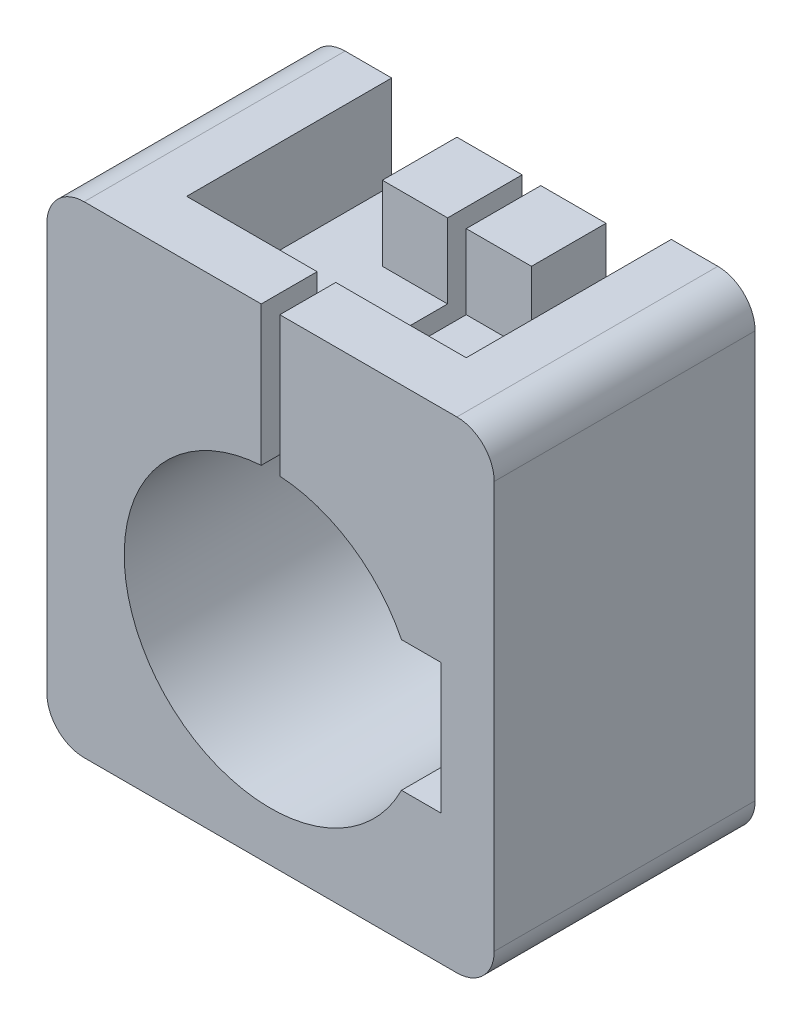
ISO-10303-21;
HEADER;
FILE_DESCRIPTION(('STEP AP214'),'2;1');
FILE_NAME('part.step','',(''),(''),'','','');
FILE_SCHEMA(('AUTOMOTIVE_DESIGN { 1 0 10303 214 1 1 1 1 }'));
ENDSEC;
DATA;
#1=APPLICATION_CONTEXT('core data for automotive mechanical design processes');
#2=APPLICATION_PROTOCOL_DEFINITION('international standard','automotive_design',2000,#1);
#3=PRODUCT_CONTEXT('',#1,'mechanical');
#4=PRODUCT('Part','Part','',(#3));
#5=PRODUCT_RELATED_PRODUCT_CATEGORY('part','',(#4));
#6=PRODUCT_DEFINITION_FORMATION('','',#4);
#7=PRODUCT_DEFINITION_CONTEXT('part definition',#1,'design');
#8=PRODUCT_DEFINITION('design','',#6,#7);
#9=PRODUCT_DEFINITION_SHAPE('','',#8);
#10=(LENGTH_UNIT() NAMED_UNIT(*) SI_UNIT(.MILLI.,.METRE.));
#11=(NAMED_UNIT(*) PLANE_ANGLE_UNIT() SI_UNIT($,.RADIAN.));
#12=(NAMED_UNIT(*) SI_UNIT($,.STERADIAN.) SOLID_ANGLE_UNIT());
#13=UNCERTAINTY_MEASURE_WITH_UNIT(LENGTH_MEASURE(1.E-05),#10,'distance_accuracy_value','');
#14=(GEOMETRIC_REPRESENTATION_CONTEXT(3) GLOBAL_UNCERTAINTY_ASSIGNED_CONTEXT((#13)) GLOBAL_UNIT_ASSIGNED_CONTEXT((#10,
#11,#12)) REPRESENTATION_CONTEXT('',''));
#15=CARTESIAN_POINT('',(0.,0.,0.));
#16=DIRECTION('',(0.,0.,1.));
#17=DIRECTION('',(1.,0.,0.));
#18=AXIS2_PLACEMENT_3D('',#15,#16,#17);
#19=CARTESIAN_POINT('',(0.5,10.3340602499598,7.));
#20=DIRECTION('',(0.,-1.,0.));
#21=DIRECTION('',(0.,0.,-1.));
#22=AXIS2_PLACEMENT_3D('',#19,#20,#21);
#23=PLANE('',#22);
#24=DIRECTION('',(0.,0.,-1.));
#25=VECTOR('',#24,1.);
#26=CARTESIAN_POINT('',(7.5,10.3340602499598,10.7268120235369));
#27=LINE('',#26,#25);
#28=CARTESIAN_POINT('',(7.5,10.3340602499598,4.));
#29=VERTEX_POINT('',#28);
#30=CARTESIAN_POINT('',(7.5,10.3340602499598,-7.));
#31=VERTEX_POINT('',#30);
#32=EDGE_CURVE('E224',#29,#31,#27,.T.);
#33=ORIENTED_EDGE('',*,*,#32,.T.);
#34=DIRECTION('',(-1.,0.,0.));
#35=VECTOR('',#34,1.);
#36=CARTESIAN_POINT('',(0.5,10.3340602499598,-7.));
#37=LINE('',#36,#35);
#38=CARTESIAN_POINT('',(4.,10.3340602499598,-7.));
#39=VERTEX_POINT('',#38);
#40=EDGE_CURVE('E236',#31,#39,#37,.T.);
#41=ORIENTED_EDGE('',*,*,#40,.T.);
#42=DIRECTION('',(0.,0.,-1.));
#43=VECTOR('',#42,1.);
#44=CARTESIAN_POINT('',(4.,10.3340602499598,-3.));
#45=LINE('',#44,#43);
#46=CARTESIAN_POINT('',(4.,10.3340602499598,-3.));
#47=VERTEX_POINT('',#46);
#48=EDGE_CURVE('E356',#47,#39,#45,.T.);
#49=ORIENTED_EDGE('',*,*,#48,.F.);
#50=DIRECTION('',(1.,0.,0.));
#51=VECTOR('',#50,1.);
#52=CARTESIAN_POINT('',(0.5,10.3340602499598,-3.));
#53=LINE('',#52,#51);
#54=CARTESIAN_POINT('',(0.5,10.3340602499598,-3.));
#55=VERTEX_POINT('',#54);
#56=EDGE_CURVE('E443',#55,#47,#53,.T.);
#57=ORIENTED_EDGE('',*,*,#56,.F.);
#58=DIRECTION('',(0.,0.,-1.));
#59=VECTOR('',#58,1.);
#60=CARTESIAN_POINT('',(0.5,10.3340602499598,7.));
#61=LINE('',#60,#59);
#62=CARTESIAN_POINT('',(0.5,10.3340602499598,4.));
#63=VERTEX_POINT('',#62);
#64=EDGE_CURVE('E286',#63,#55,#61,.T.);
#65=ORIENTED_EDGE('',*,*,#64,.F.);
#66=DIRECTION('',(-1.,0.,0.));
#67=VECTOR('',#66,1.);
#68=CARTESIAN_POINT('',(0.5,10.3340602499598,4.));
#69=LINE('',#68,#67);
#70=EDGE_CURVE('E239',#29,#63,#69,.T.);
#71=ORIENTED_EDGE('',*,*,#70,.F.);
#72=EDGE_LOOP('',(#33,#41,#49,#57,#65,#71));
#73=FACE_BOUND('',#72,.T.);
#74=ADVANCED_FACE('F34',(#73),#23,.F.);
#75=CARTESIAN_POINT('',(0.,0.,4.));
#76=DIRECTION('',(0.,0.,-1.));
#77=DIRECTION('',(-1.,0.,0.));
#78=AXIS2_PLACEMENT_3D('',#75,#76,#77);
#79=PLANE('',#78);
#80=DIRECTION('',(1.,0.,0.));
#81=VECTOR('',#80,1.);
#82=CARTESIAN_POINT('',(0.5,15.3340602499598,4.));
#83=LINE('',#82,#81);
#84=CARTESIAN_POINT('',(0.5,15.3340602499598,4.));
#85=VERTEX_POINT('',#84);
#86=CARTESIAN_POINT('',(7.5,15.3340602499598,4.));
#87=VERTEX_POINT('',#86);
#88=EDGE_CURVE('E502',#85,#87,#83,.T.);
#89=ORIENTED_EDGE('',*,*,#88,.T.);
#90=DIRECTION('',(0.,1.,0.));
#91=VECTOR('',#90,1.);
#92=CARTESIAN_POINT('',(7.5,15.3340602499598,4.));
#93=LINE('',#92,#91);
#94=EDGE_CURVE('E240',#29,#87,#93,.T.);
#95=ORIENTED_EDGE('',*,*,#94,.F.);
#96=ORIENTED_EDGE('',*,*,#70,.T.);
#97=DIRECTION('',(0.,1.,0.));
#98=VECTOR('',#97,1.);
#99=CARTESIAN_POINT('',(0.5,10.3340602499598,4.));
#100=LINE('',#99,#98);
#101=EDGE_CURVE('E499',#63,#85,#100,.T.);
#102=ORIENTED_EDGE('',*,*,#101,.T.);
#103=EDGE_LOOP('',(#89,#95,#96,#102));
#104=FACE_BOUND('',#103,.T.);
#105=ADVANCED_FACE('F381',(#104),#79,.T.);
#106=CARTESIAN_POINT('',(-12.,10.3340602499598,7.));
#107=DIRECTION('',(0.,-1.,0.));
#108=DIRECTION('',(0.,0.,-1.));
#109=AXIS2_PLACEMENT_3D('',#106,#107,#108);
#110=PLANE('',#109);
#111=DIRECTION('',(0.,0.,-1.));
#112=VECTOR('',#111,1.);
#113=CARTESIAN_POINT('',(-7.5,10.3340602499598,10.7268120235369));
#114=LINE('',#113,#112);
#115=CARTESIAN_POINT('',(-7.5,10.3340602499598,4.));
#116=VERTEX_POINT('',#115);
#117=CARTESIAN_POINT('',(-7.5,10.3340602499598,-7.));
#118=VERTEX_POINT('',#117);
#119=EDGE_CURVE('E477',#116,#118,#114,.T.);
#120=ORIENTED_EDGE('',*,*,#119,.F.);
#121=DIRECTION('',(-1.,0.,0.));
#122=VECTOR('',#121,1.);
#123=CARTESIAN_POINT('',(-0.5,10.3340602499598,4.));
#124=LINE('',#123,#122);
#125=CARTESIAN_POINT('',(-0.5,10.3340602499598,4.));
#126=VERTEX_POINT('',#125);
#127=EDGE_CURVE('E491',#126,#116,#124,.T.);
#128=ORIENTED_EDGE('',*,*,#127,.F.);
#129=DIRECTION('',(0.,0.,-1.));
#130=VECTOR('',#129,1.);
#131=CARTESIAN_POINT('',(-0.5,10.3340602499598,7.));
#132=LINE('',#131,#130);
#133=CARTESIAN_POINT('',(-0.5,10.3340602499598,-3.));
#134=VERTEX_POINT('',#133);
#135=EDGE_CURVE('E288',#126,#134,#132,.T.);
#136=ORIENTED_EDGE('',*,*,#135,.T.);
#137=DIRECTION('',(1.,0.,0.));
#138=VECTOR('',#137,1.);
#139=CARTESIAN_POINT('',(-0.5,10.3340602499598,-3.));
#140=LINE('',#139,#138);
#141=CARTESIAN_POINT('',(-4.,10.3340602499598,-3.));
#142=VERTEX_POINT('',#141);
#143=EDGE_CURVE('E514',#142,#134,#140,.T.);
#144=ORIENTED_EDGE('',*,*,#143,.F.);
#145=DIRECTION('',(0.,0.,-1.));
#146=VECTOR('',#145,1.);
#147=CARTESIAN_POINT('',(-4.,10.3340602499598,-3.));
#148=LINE('',#147,#146);
#149=CARTESIAN_POINT('',(-4.,10.3340602499598,-7.));
#150=VERTEX_POINT('',#149);
#151=EDGE_CURVE('E436',#142,#150,#148,.T.);
#152=ORIENTED_EDGE('',*,*,#151,.T.);
#153=DIRECTION('',(-1.,0.,0.));
#154=VECTOR('',#153,1.);
#155=CARTESIAN_POINT('',(-12.,10.3340602499598,-7.));
#156=LINE('',#155,#154);
#157=EDGE_CURVE('E355',#150,#118,#156,.T.);
#158=ORIENTED_EDGE('',*,*,#157,.T.);
#159=EDGE_LOOP('',(#120,#128,#136,#144,#152,#158));
#160=FACE_BOUND('',#159,.T.);
#161=ADVANCED_FACE('F386',(#160),#110,.F.);
#162=CARTESIAN_POINT('',(0.,0.,4.));
#163=DIRECTION('',(0.,0.,1.));
#164=DIRECTION('',(1.,0.,0.));
#165=AXIS2_PLACEMENT_3D('',#162,#163,#164);
#166=PLANE('',#165);
#167=DIRECTION('',(0.,-1.,0.));
#168=VECTOR('',#167,1.);
#169=CARTESIAN_POINT('',(-7.5,15.3340602499598,4.));
#170=LINE('',#169,#168);
#171=CARTESIAN_POINT('',(-7.5,15.3340602499598,4.));
#172=VERTEX_POINT('',#171);
#173=EDGE_CURVE('E484',#172,#116,#170,.T.);
#174=ORIENTED_EDGE('',*,*,#173,.F.);
#175=DIRECTION('',(1.,0.,0.));
#176=VECTOR('',#175,1.);
#177=CARTESIAN_POINT('',(-0.5,15.3340602499598,4.));
#178=LINE('',#177,#176);
#179=CARTESIAN_POINT('',(-0.5,15.3340602499598,4.));
#180=VERTEX_POINT('',#179);
#181=EDGE_CURVE('E493',#172,#180,#178,.T.);
#182=ORIENTED_EDGE('',*,*,#181,.T.);
#183=DIRECTION('',(0.,-1.,0.));
#184=VECTOR('',#183,1.);
#185=CARTESIAN_POINT('',(-0.5,10.3340602499598,4.));
#186=LINE('',#185,#184);
#187=EDGE_CURVE('E489',#180,#126,#186,.T.);
#188=ORIENTED_EDGE('',*,*,#187,.T.);
#189=ORIENTED_EDGE('',*,*,#127,.T.);
#190=EDGE_LOOP('',(#174,#182,#188,#189));
#191=FACE_BOUND('',#190,.T.);
#192=ADVANCED_FACE('F402',(#191),#166,.F.);
#193=CARTESIAN_POINT('',(-0.5,10.3340602499598,7.));
#194=DIRECTION('',(-1.,0.,0.));
#195=DIRECTION('',(0.,-1.,0.));
#196=AXIS2_PLACEMENT_3D('',#193,#194,#195);
#197=PLANE('',#196);
#198=DIRECTION('',(0.,1.,0.));
#199=VECTOR('',#198,1.);
#200=CARTESIAN_POINT('',(-0.5,10.3340602499598,-7.));
#201=LINE('',#200,#199);
#202=CARTESIAN_POINT('',(-0.500000000000001,7.83406024995979,-7.));
#203=VERTEX_POINT('',#202);
#204=CARTESIAN_POINT('',(-0.5,14.3340602499598,-7.));
#205=VERTEX_POINT('',#204);
#206=EDGE_CURVE('E353',#203,#205,#201,.T.);
#207=ORIENTED_EDGE('',*,*,#206,.T.);
#208=DIRECTION('',(0.,0.,-1.));
#209=VECTOR('',#208,1.);
#210=CARTESIAN_POINT('',(-0.5,14.3340602499598,-3.));
#211=LINE('',#210,#209);
#212=CARTESIAN_POINT('',(-0.5,14.3340602499598,-3.));
#213=VERTEX_POINT('',#212);
#214=EDGE_CURVE('E416',#213,#205,#211,.T.);
#215=ORIENTED_EDGE('',*,*,#214,.F.);
#216=DIRECTION('',(0.,1.,0.));
#217=VECTOR('',#216,1.);
#218=CARTESIAN_POINT('',(-0.5,10.3340602499598,-3.));
#219=LINE('',#218,#217);
#220=EDGE_CURVE('E508',#134,#213,#219,.T.);
#221=ORIENTED_EDGE('',*,*,#220,.F.);
#222=ORIENTED_EDGE('',*,*,#135,.F.);
#223=ORIENTED_EDGE('',*,*,#187,.F.);
#224=DIRECTION('',(0.,0.,1.));
#225=VECTOR('',#224,1.);
#226=CARTESIAN_POINT('',(-0.5,15.3340602499598,4.));
#227=LINE('',#226,#225);
#228=CARTESIAN_POINT('',(-0.5,15.3340602499598,7.));
#229=VERTEX_POINT('',#228);
#230=EDGE_CURVE('E495',#180,#229,#227,.T.);
#231=ORIENTED_EDGE('',*,*,#230,.T.);
#232=DIRECTION('',(0.,1.,0.));
#233=VECTOR('',#232,1.);
#234=CARTESIAN_POINT('',(-0.5,10.3340602499598,7.));
#235=LINE('',#234,#233);
#236=CARTESIAN_POINT('',(-0.500000000000001,7.83406024995979,7.));
#237=VERTEX_POINT('',#236);
#238=EDGE_CURVE('E266',#237,#229,#235,.T.);
#239=ORIENTED_EDGE('',*,*,#238,.F.);
#240=DIRECTION('',(0.,0.,-1.));
#241=VECTOR('',#240,1.);
#242=CARTESIAN_POINT('',(-0.500000000000001,7.83406024995979,7.));
#243=LINE('',#242,#241);
#244=EDGE_CURVE('E267',#237,#203,#243,.T.);
#245=ORIENTED_EDGE('',*,*,#244,.T.);
#246=EDGE_LOOP('',(#207,#215,#221,#222,#223,#231,#239,#245));
#247=FACE_BOUND('',#246,.T.);
#248=ADVANCED_FACE('F400',(#247),#197,.F.);
#249=CARTESIAN_POINT('',(-12.,-10.5,7.));
#250=DIRECTION('',(1.,0.,0.));
#251=DIRECTION('',(0.,0.,-1.));
#252=AXIS2_PLACEMENT_3D('',#249,#250,#251);
#253=PLANE('',#252);
#254=DIRECTION('',(0.,-1.,0.));
#255=VECTOR('',#254,1.);
#256=CARTESIAN_POINT('',(-12.,-10.5,-7.));
#257=LINE('',#256,#255);
#258=CARTESIAN_POINT('',(-12.,13.3340602499598,-7.));
#259=VERTEX_POINT('',#258);
#260=CARTESIAN_POINT('',(-12.,-8.5,-7.));
#261=VERTEX_POINT('',#260);
#262=EDGE_CURVE('E358',#259,#261,#257,.T.);
#263=ORIENTED_EDGE('',*,*,#262,.T.);
#264=DIRECTION('',(0.,0.,-1.));
#265=VECTOR('',#264,1.);
#266=CARTESIAN_POINT('',(-12.,-8.5,7.));
#267=LINE('',#266,#265);
#268=CARTESIAN_POINT('',(-12.,-8.5,7.));
#269=VERTEX_POINT('',#268);
#270=EDGE_CURVE('E57',#261,#269,#267,.F.);
#271=ORIENTED_EDGE('',*,*,#270,.T.);
#272=DIRECTION('',(0.,-1.,0.));
#273=VECTOR('',#272,1.);
#274=CARTESIAN_POINT('',(-12.,-10.5,7.));
#275=LINE('',#274,#273);
#276=CARTESIAN_POINT('',(-12.,13.3340602499598,7.));
#277=VERTEX_POINT('',#276);
#278=EDGE_CURVE('E341',#277,#269,#275,.T.);
#279=ORIENTED_EDGE('',*,*,#278,.F.);
#280=DIRECTION('',(0.,0.,1.));
#281=VECTOR('',#280,1.);
#282=CARTESIAN_POINT('',(-12.,13.3340602499598,7.));
#283=LINE('',#282,#281);
#284=EDGE_CURVE('E316',#277,#259,#283,.F.);
#285=ORIENTED_EDGE('',*,*,#284,.T.);
#286=EDGE_LOOP('',(#263,#271,#279,#285));
#287=FACE_BOUND('',#286,.T.);
#288=ADVANCED_FACE('F397',(#287),#253,.F.);
#289=CARTESIAN_POINT('',(-12.,-10.5,7.));
#290=DIRECTION('',(0.,1.,0.));
#291=DIRECTION('',(0.,0.,1.));
#292=AXIS2_PLACEMENT_3D('',#289,#290,#291);
#293=PLANE('',#292);
#294=DIRECTION('',(1.,0.,0.));
#295=VECTOR('',#294,1.);
#296=CARTESIAN_POINT('',(-12.,-10.5,-7.));
#297=LINE('',#296,#295);
#298=CARTESIAN_POINT('',(-10.,-10.5,-7.));
#299=VERTEX_POINT('',#298);
#300=CARTESIAN_POINT('',(10.,-10.5,-7.));
#301=VERTEX_POINT('',#300);
#302=EDGE_CURVE('E253',#299,#301,#297,.T.);
#303=ORIENTED_EDGE('',*,*,#302,.T.);
#304=DIRECTION('',(0.,0.,-1.));
#305=VECTOR('',#304,1.);
#306=CARTESIAN_POINT('',(10.,-10.5,7.));
#307=LINE('',#306,#305);
#308=CARTESIAN_POINT('',(10.,-10.5,7.));
#309=VERTEX_POINT('',#308);
#310=EDGE_CURVE('E307',#301,#309,#307,.F.);
#311=ORIENTED_EDGE('',*,*,#310,.T.);
#312=DIRECTION('',(1.,0.,0.));
#313=VECTOR('',#312,1.);
#314=CARTESIAN_POINT('',(-12.,-10.5,7.));
#315=LINE('',#314,#313);
#316=CARTESIAN_POINT('',(-10.,-10.5,7.));
#317=VERTEX_POINT('',#316);
#318=EDGE_CURVE('E337',#317,#309,#315,.T.);
#319=ORIENTED_EDGE('',*,*,#318,.F.);
#320=DIRECTION('',(0.,0.,-1.));
#321=VECTOR('',#320,1.);
#322=CARTESIAN_POINT('',(-10.,-10.5,7.));
#323=LINE('',#322,#321);
#324=EDGE_CURVE('E304',#317,#299,#323,.T.);
#325=ORIENTED_EDGE('',*,*,#324,.T.);
#326=EDGE_LOOP('',(#303,#311,#319,#325));
#327=FACE_BOUND('',#326,.T.);
#328=ADVANCED_FACE('F363',(#327),#293,.F.);
#329=CARTESIAN_POINT('',(12.,10.3340602499598,7.));
#330=DIRECTION('',(-1.,0.,0.));
#331=DIRECTION('',(0.,0.,1.));
#332=AXIS2_PLACEMENT_3D('',#329,#330,#331);
#333=PLANE('',#332);
#334=DIRECTION('',(0.,1.,0.));
#335=VECTOR('',#334,1.);
#336=CARTESIAN_POINT('',(12.,10.3340602499598,7.));
#337=LINE('',#336,#335);
#338=CARTESIAN_POINT('',(12.,-8.5,7.));
#339=VERTEX_POINT('',#338);
#340=CARTESIAN_POINT('',(12.,13.3340602499598,7.));
#341=VERTEX_POINT('',#340);
#342=EDGE_CURVE('E331',#339,#341,#337,.T.);
#343=ORIENTED_EDGE('',*,*,#342,.F.);
#344=DIRECTION('',(0.,0.,-1.));
#345=VECTOR('',#344,1.);
#346=CARTESIAN_POINT('',(12.,-8.5,7.));
#347=LINE('',#346,#345);
#348=CARTESIAN_POINT('',(12.,-8.5,-7.));
#349=VERTEX_POINT('',#348);
#350=EDGE_CURVE('E293',#339,#349,#347,.T.);
#351=ORIENTED_EDGE('',*,*,#350,.T.);
#352=DIRECTION('',(0.,1.,0.));
#353=VECTOR('',#352,1.);
#354=CARTESIAN_POINT('',(12.,10.3340602499598,-7.));
#355=LINE('',#354,#353);
#356=CARTESIAN_POINT('',(12.,13.3340602499598,-7.));
#357=VERTEX_POINT('',#356);
#358=EDGE_CURVE('E248',#349,#357,#355,.T.);
#359=ORIENTED_EDGE('',*,*,#358,.T.);
#360=DIRECTION('',(0.,0.,1.));
#361=VECTOR('',#360,1.);
#362=CARTESIAN_POINT('',(12.,13.3340602499598,7.));
#363=LINE('',#362,#361);
#364=EDGE_CURVE('E290',#357,#341,#363,.T.);
#365=ORIENTED_EDGE('',*,*,#364,.T.);
#366=EDGE_LOOP('',(#343,#351,#359,#365));
#367=FACE_BOUND('',#366,.T.);
#368=ADVANCED_FACE('F330',(#367),#333,.F.);
#369=CARTESIAN_POINT('',(0.5,10.3340602499598,7.));
#370=DIRECTION('',(1.,0.,0.));
#371=DIRECTION('',(0.,1.,0.));
#372=AXIS2_PLACEMENT_3D('',#369,#370,#371);
#373=PLANE('',#372);
#374=DIRECTION('',(0.,-1.,0.));
#375=VECTOR('',#374,1.);
#376=CARTESIAN_POINT('',(0.5,10.3340602499598,-7.));
#377=LINE('',#376,#375);
#378=CARTESIAN_POINT('',(0.5,14.3340602499598,-7.));
#379=VERTEX_POINT('',#378);
#380=CARTESIAN_POINT('',(0.500000000000001,7.83406024995979,-7.));
#381=VERTEX_POINT('',#380);
#382=EDGE_CURVE('E247',#379,#381,#377,.T.);
#383=ORIENTED_EDGE('',*,*,#382,.T.);
#384=DIRECTION('',(0.,0.,-1.));
#385=VECTOR('',#384,1.);
#386=CARTESIAN_POINT('',(0.500000000000001,7.83406024995979,7.));
#387=LINE('',#386,#385);
#388=CARTESIAN_POINT('',(0.500000000000001,7.83406024995979,7.));
#389=VERTEX_POINT('',#388);
#390=EDGE_CURVE('E283',#389,#381,#387,.T.);
#391=ORIENTED_EDGE('',*,*,#390,.F.);
#392=DIRECTION('',(0.,-1.,0.));
#393=VECTOR('',#392,1.);
#394=CARTESIAN_POINT('',(0.5,10.3340602499598,7.));
#395=LINE('',#394,#393);
#396=CARTESIAN_POINT('',(0.5,15.3340602499598,7.));
#397=VERTEX_POINT('',#396);
#398=EDGE_CURVE('E336',#397,#389,#395,.T.);
#399=ORIENTED_EDGE('',*,*,#398,.F.);
#400=DIRECTION('',(0.,0.,1.));
#401=VECTOR('',#400,1.);
#402=CARTESIAN_POINT('',(0.5,15.3340602499598,4.));
#403=LINE('',#402,#401);
#404=EDGE_CURVE('E427',#85,#397,#403,.T.);
#405=ORIENTED_EDGE('',*,*,#404,.F.);
#406=ORIENTED_EDGE('',*,*,#101,.F.);
#407=ORIENTED_EDGE('',*,*,#64,.T.);
#408=DIRECTION('',(0.,-1.,0.));
#409=VECTOR('',#408,1.);
#410=CARTESIAN_POINT('',(0.5,10.3340602499598,-3.));
#411=LINE('',#410,#409);
#412=CARTESIAN_POINT('',(0.5,14.3340602499598,-3.));
#413=VERTEX_POINT('',#412);
#414=EDGE_CURVE('E440',#413,#55,#411,.T.);
#415=ORIENTED_EDGE('',*,*,#414,.F.);
#416=DIRECTION('',(0.,0.,-1.));
#417=VECTOR('',#416,1.);
#418=CARTESIAN_POINT('',(0.5,14.3340602499598,-3.));
#419=LINE('',#418,#417);
#420=EDGE_CURVE('E449',#413,#379,#419,.T.);
#421=ORIENTED_EDGE('',*,*,#420,.T.);
#422=EDGE_LOOP('',(#383,#391,#399,#405,#406,#407,#415,#421));
#423=FACE_BOUND('',#422,.T.);
#424=ADVANCED_FACE('F391',(#423),#373,.F.);
#425=CARTESIAN_POINT('',(0.,0.,7.));
#426=DIRECTION('',(0.,0.,-1.));
#427=DIRECTION('',(-1.,0.,0.));
#428=AXIS2_PLACEMENT_3D('',#425,#426,#427);
#429=CYLINDRICAL_SURFACE('',#428,7.85);
#430=CARTESIAN_POINT('',(0.,0.,-7.));
#431=DIRECTION('',(0.,0.,-1.));
#432=DIRECTION('',(1.,0.,0.));
#433=AXIS2_PLACEMENT_3D('',#430,#431,#432);
#434=CIRCLE('',#433,7.85);
#435=CARTESIAN_POINT('',(7.026556767009,3.5,-7.));
#436=VERTEX_POINT('',#435);
#437=EDGE_CURVE('E250',#381,#436,#434,.T.);
#438=ORIENTED_EDGE('',*,*,#437,.T.);
#439=DIRECTION('',(0.,0.,-1.));
#440=VECTOR('',#439,1.);
#441=CARTESIAN_POINT('',(7.026556767009,3.5,7.));
#442=LINE('',#441,#440);
#443=CARTESIAN_POINT('',(7.026556767009,3.5,7.));
#444=VERTEX_POINT('',#443);
#445=EDGE_CURVE('E280',#444,#436,#442,.T.);
#446=ORIENTED_EDGE('',*,*,#445,.F.);
#447=CARTESIAN_POINT('',(0.,0.,7.));
#448=DIRECTION('',(0.,0.,-1.));
#449=DIRECTION('',(1.,0.,0.));
#450=AXIS2_PLACEMENT_3D('',#447,#448,#449);
#451=CIRCLE('',#450,7.85);
#452=EDGE_CURVE('E339',#389,#444,#451,.T.);
#453=ORIENTED_EDGE('',*,*,#452,.F.);
#454=ORIENTED_EDGE('',*,*,#390,.T.);
#455=EDGE_LOOP('',(#438,#446,#453,#454));
#456=FACE_BOUND('',#455,.T.);
#457=ADVANCED_FACE('F550',(#456),#429,.F.);
#458=CARTESIAN_POINT('',(9.15,3.5,7.));
#459=DIRECTION('',(0.,1.,0.));
#460=DIRECTION('',(0.,0.,1.));
#461=AXIS2_PLACEMENT_3D('',#458,#459,#460);
#462=PLANE('',#461);
#463=DIRECTION('',(1.,0.,0.));
#464=VECTOR('',#463,1.);
#465=CARTESIAN_POINT('',(9.15,3.5,-7.));
#466=LINE('',#465,#464);
#467=CARTESIAN_POINT('',(9.15,3.5,-7.));
#468=VERTEX_POINT('',#467);
#469=EDGE_CURVE('E258',#436,#468,#466,.T.);
#470=ORIENTED_EDGE('',*,*,#469,.T.);
#471=DIRECTION('',(0.,0.,-1.));
#472=VECTOR('',#471,1.);
#473=CARTESIAN_POINT('',(9.15,3.5,7.));
#474=LINE('',#473,#472);
#475=CARTESIAN_POINT('',(9.15,3.5,7.));
#476=VERTEX_POINT('',#475);
#477=EDGE_CURVE('E277',#476,#468,#474,.T.);
#478=ORIENTED_EDGE('',*,*,#477,.F.);
#479=DIRECTION('',(1.,0.,0.));
#480=VECTOR('',#479,1.);
#481=CARTESIAN_POINT('',(9.15,3.5,7.));
#482=LINE('',#481,#480);
#483=EDGE_CURVE('E346',#444,#476,#482,.T.);
#484=ORIENTED_EDGE('',*,*,#483,.F.);
#485=ORIENTED_EDGE('',*,*,#445,.T.);
#486=EDGE_LOOP('',(#470,#478,#484,#485));
#487=FACE_BOUND('',#486,.T.);
#488=ADVANCED_FACE('F546',(#487),#462,.F.);
#489=CARTESIAN_POINT('',(9.15,3.5,7.));
#490=DIRECTION('',(1.,0.,0.));
#491=DIRECTION('',(0.,0.,-1.));
#492=AXIS2_PLACEMENT_3D('',#489,#490,#491);
#493=PLANE('',#492);
#494=DIRECTION('',(0.,-1.,0.));
#495=VECTOR('',#494,1.);
#496=CARTESIAN_POINT('',(9.15,3.5,-7.));
#497=LINE('',#496,#495);
#498=CARTESIAN_POINT('',(9.15,-3.5,-7.));
#499=VERTEX_POINT('',#498);
#500=EDGE_CURVE('E260',#468,#499,#497,.T.);
#501=ORIENTED_EDGE('',*,*,#500,.T.);
#502=DIRECTION('',(0.,0.,-1.));
#503=VECTOR('',#502,1.);
#504=CARTESIAN_POINT('',(9.15,-3.5,7.));
#505=LINE('',#504,#503);
#506=CARTESIAN_POINT('',(9.15,-3.5,7.));
#507=VERTEX_POINT('',#506);
#508=EDGE_CURVE('E274',#507,#499,#505,.T.);
#509=ORIENTED_EDGE('',*,*,#508,.F.);
#510=DIRECTION('',(0.,-1.,0.));
#511=VECTOR('',#510,1.);
#512=CARTESIAN_POINT('',(9.15,3.5,7.));
#513=LINE('',#512,#511);
#514=EDGE_CURVE('E348',#476,#507,#513,.T.);
#515=ORIENTED_EDGE('',*,*,#514,.F.);
#516=ORIENTED_EDGE('',*,*,#477,.T.);
#517=EDGE_LOOP('',(#501,#509,#515,#516));
#518=FACE_BOUND('',#517,.T.);
#519=ADVANCED_FACE('F542',(#518),#493,.F.);
#520=CARTESIAN_POINT('',(9.15,-3.5,7.));
#521=DIRECTION('',(0.,-1.,0.));
#522=DIRECTION('',(0.,0.,-1.));
#523=AXIS2_PLACEMENT_3D('',#520,#521,#522);
#524=PLANE('',#523);
#525=DIRECTION('',(-1.,0.,0.));
#526=VECTOR('',#525,1.);
#527=CARTESIAN_POINT('',(9.15,-3.5,-7.));
#528=LINE('',#527,#526);
#529=CARTESIAN_POINT('',(7.026556767009,-3.5,-7.));
#530=VERTEX_POINT('',#529);
#531=EDGE_CURVE('E262',#499,#530,#528,.T.);
#532=ORIENTED_EDGE('',*,*,#531,.T.);
#533=DIRECTION('',(0.,0.,-1.));
#534=VECTOR('',#533,1.);
#535=CARTESIAN_POINT('',(7.026556767009,-3.5,7.));
#536=LINE('',#535,#534);
#537=CARTESIAN_POINT('',(7.026556767009,-3.5,7.));
#538=VERTEX_POINT('',#537);
#539=EDGE_CURVE('E270',#538,#530,#536,.T.);
#540=ORIENTED_EDGE('',*,*,#539,.F.);
#541=DIRECTION('',(-1.,0.,0.));
#542=VECTOR('',#541,1.);
#543=CARTESIAN_POINT('',(9.15,-3.5,7.));
#544=LINE('',#543,#542);
#545=EDGE_CURVE('E350',#507,#538,#544,.T.);
#546=ORIENTED_EDGE('',*,*,#545,.F.);
#547=ORIENTED_EDGE('',*,*,#508,.T.);
#548=EDGE_LOOP('',(#532,#540,#546,#547));
#549=FACE_BOUND('',#548,.T.);
#550=ADVANCED_FACE('F538',(#549),#524,.F.);
#551=CARTESIAN_POINT('',(0.,0.,7.));
#552=DIRECTION('',(0.,0.,-1.));
#553=DIRECTION('',(-1.,0.,0.));
#554=AXIS2_PLACEMENT_3D('',#551,#552,#553);
#555=CYLINDRICAL_SURFACE('',#554,7.85);
#556=CARTESIAN_POINT('',(0.,0.,-7.));
#557=DIRECTION('',(0.,0.,-1.));
#558=DIRECTION('',(1.,0.,0.));
#559=AXIS2_PLACEMENT_3D('',#556,#557,#558);
#560=CIRCLE('',#559,7.85);
#561=EDGE_CURVE('E264',#530,#203,#560,.T.);
#562=ORIENTED_EDGE('',*,*,#561,.T.);
#563=ORIENTED_EDGE('',*,*,#244,.F.);
#564=CARTESIAN_POINT('',(0.,0.,7.));
#565=DIRECTION('',(0.,0.,-1.));
#566=DIRECTION('',(1.,0.,0.));
#567=AXIS2_PLACEMENT_3D('',#564,#565,#566);
#568=CIRCLE('',#567,7.85);
#569=EDGE_CURVE('E271',#538,#237,#568,.T.);
#570=ORIENTED_EDGE('',*,*,#569,.F.);
#571=ORIENTED_EDGE('',*,*,#539,.T.);
#572=EDGE_LOOP('',(#562,#563,#570,#571));
#573=FACE_BOUND('',#572,.T.);
#574=ADVANCED_FACE('F533',(#573),#555,.F.);
#575=CARTESIAN_POINT('',(0.,0.,7.));
#576=DIRECTION('',(0.,0.,1.));
#577=DIRECTION('',(1.,0.,0.));
#578=AXIS2_PLACEMENT_3D('',#575,#576,#577);
#579=PLANE('',#578);
#580=ORIENTED_EDGE('',*,*,#318,.T.);
#581=CARTESIAN_POINT('',(10.,-8.5,7.));
#582=DIRECTION('',(0.,0.,1.));
#583=DIRECTION('',(1.,0.,0.));
#584=AXIS2_PLACEMENT_3D('',#581,#582,#583);
#585=CIRCLE('',#584,2.);
#586=EDGE_CURVE('E314',#309,#339,#585,.T.);
#587=ORIENTED_EDGE('',*,*,#586,.T.);
#588=ORIENTED_EDGE('',*,*,#342,.T.);
#589=CARTESIAN_POINT('',(10.,13.3340602499598,7.));
#590=DIRECTION('',(0.,0.,1.));
#591=DIRECTION('',(1.,0.,0.));
#592=AXIS2_PLACEMENT_3D('',#589,#590,#591);
#593=CIRCLE('',#592,2.);
#594=CARTESIAN_POINT('',(10.,15.3340602499598,7.));
#595=VERTEX_POINT('',#594);
#596=EDGE_CURVE('E49',#341,#595,#593,.T.);
#597=ORIENTED_EDGE('',*,*,#596,.T.);
#598=DIRECTION('',(1.,0.,0.));
#599=VECTOR('',#598,1.);
#600=CARTESIAN_POINT('',(0.5,15.3340602499598,7.));
#601=LINE('',#600,#599);
#602=EDGE_CURVE('E322',#397,#595,#601,.T.);
#603=ORIENTED_EDGE('',*,*,#602,.F.);
#604=ORIENTED_EDGE('',*,*,#398,.T.);
#605=ORIENTED_EDGE('',*,*,#452,.T.);
#606=ORIENTED_EDGE('',*,*,#483,.T.);
#607=ORIENTED_EDGE('',*,*,#514,.T.);
#608=ORIENTED_EDGE('',*,*,#545,.T.);
#609=ORIENTED_EDGE('',*,*,#569,.T.);
#610=ORIENTED_EDGE('',*,*,#238,.T.);
#611=DIRECTION('',(1.,0.,0.));
#612=VECTOR('',#611,1.);
#613=CARTESIAN_POINT('',(-0.5,15.3340602499598,7.));
#614=LINE('',#613,#612);
#615=CARTESIAN_POINT('',(-10.,15.3340602499598,7.));
#616=VERTEX_POINT('',#615);
#617=EDGE_CURVE('E486',#616,#229,#614,.T.);
#618=ORIENTED_EDGE('',*,*,#617,.F.);
#619=CARTESIAN_POINT('',(-10.,13.3340602499598,7.));
#620=DIRECTION('',(0.,0.,1.));
#621=DIRECTION('',(1.,0.,0.));
#622=AXIS2_PLACEMENT_3D('',#619,#620,#621);
#623=CIRCLE('',#622,2.);
#624=EDGE_CURVE('E309',#616,#277,#623,.T.);
#625=ORIENTED_EDGE('',*,*,#624,.T.);
#626=ORIENTED_EDGE('',*,*,#278,.T.);
#627=CARTESIAN_POINT('',(-10.,-8.5,7.));
#628=DIRECTION('',(0.,0.,1.));
#629=DIRECTION('',(1.,0.,0.));
#630=AXIS2_PLACEMENT_3D('',#627,#628,#629);
#631=CIRCLE('',#630,2.);
#632=EDGE_CURVE('E312',#269,#317,#631,.T.);
#633=ORIENTED_EDGE('',*,*,#632,.T.);
#634=EDGE_LOOP('',(#580,#587,#588,#597,#603,#604,#605,#606,#607,#608,#609,#610,#618,#625,#626,#633));
#635=FACE_BOUND('',#634,.T.);
#636=ADVANCED_FACE('F334',(#635),#579,.T.);
#637=CARTESIAN_POINT('',(0.,0.,-7.));
#638=DIRECTION('',(0.,0.,1.));
#639=DIRECTION('',(1.,0.,0.));
#640=AXIS2_PLACEMENT_3D('',#637,#638,#639);
#641=PLANE('',#640);
#642=ORIENTED_EDGE('',*,*,#358,.F.);
#643=CARTESIAN_POINT('',(10.,-8.5,-7.));
#644=DIRECTION('',(0.,0.,1.));
#645=DIRECTION('',(1.,0.,0.));
#646=AXIS2_PLACEMENT_3D('',#643,#644,#645);
#647=CIRCLE('',#646,2.);
#648=EDGE_CURVE('E302',#349,#301,#647,.F.);
#649=ORIENTED_EDGE('',*,*,#648,.T.);
#650=ORIENTED_EDGE('',*,*,#302,.F.);
#651=CARTESIAN_POINT('',(-10.,-8.5,-7.));
#652=DIRECTION('',(0.,0.,1.));
#653=DIRECTION('',(1.,0.,0.));
#654=AXIS2_PLACEMENT_3D('',#651,#652,#653);
#655=CIRCLE('',#654,2.);
#656=EDGE_CURVE('E300',#299,#261,#655,.F.);
#657=ORIENTED_EDGE('',*,*,#656,.T.);
#658=ORIENTED_EDGE('',*,*,#262,.F.);
#659=CARTESIAN_POINT('',(-10.,13.3340602499598,-7.));
#660=DIRECTION('',(0.,0.,1.));
#661=DIRECTION('',(1.,0.,0.));
#662=AXIS2_PLACEMENT_3D('',#659,#660,#661);
#663=CIRCLE('',#662,2.);
#664=CARTESIAN_POINT('',(-10.,15.3340602499598,-7.));
#665=VERTEX_POINT('',#664);
#666=EDGE_CURVE('E296',#259,#665,#663,.F.);
#667=ORIENTED_EDGE('',*,*,#666,.T.);
#668=DIRECTION('',(1.,0.,0.));
#669=VECTOR('',#668,1.);
#670=CARTESIAN_POINT('',(-12.,15.3340602499598,-7.));
#671=LINE('',#670,#669);
#672=CARTESIAN_POINT('',(-7.5,15.3340602499598,-7.));
#673=VERTEX_POINT('',#672);
#674=EDGE_CURVE('E469',#665,#673,#671,.T.);
#675=ORIENTED_EDGE('',*,*,#674,.T.);
#676=DIRECTION('',(0.,-1.,0.));
#677=VECTOR('',#676,1.);
#678=CARTESIAN_POINT('',(-7.5,15.3340602499598,-7.));
#679=LINE('',#678,#677);
#680=EDGE_CURVE('E478',#673,#118,#679,.T.);
#681=ORIENTED_EDGE('',*,*,#680,.T.);
#682=ORIENTED_EDGE('',*,*,#157,.F.);
#683=DIRECTION('',(0.,-1.,0.));
#684=VECTOR('',#683,1.);
#685=CARTESIAN_POINT('',(-4.,10.3340602499598,-7.));
#686=LINE('',#685,#684);
#687=CARTESIAN_POINT('',(-4.,14.3340602499598,-7.));
#688=VERTEX_POINT('',#687);
#689=EDGE_CURVE('E423',#688,#150,#686,.T.);
#690=ORIENTED_EDGE('',*,*,#689,.F.);
#691=DIRECTION('',(-1.,0.,0.));
#692=VECTOR('',#691,1.);
#693=CARTESIAN_POINT('',(-0.5,14.3340602499598,-7.));
#694=LINE('',#693,#692);
#695=EDGE_CURVE('E421',#205,#688,#694,.T.);
#696=ORIENTED_EDGE('',*,*,#695,.F.);
#697=ORIENTED_EDGE('',*,*,#206,.F.);
#698=ORIENTED_EDGE('',*,*,#561,.F.);
#699=ORIENTED_EDGE('',*,*,#531,.F.);
#700=ORIENTED_EDGE('',*,*,#500,.F.);
#701=ORIENTED_EDGE('',*,*,#469,.F.);
#702=ORIENTED_EDGE('',*,*,#437,.F.);
#703=ORIENTED_EDGE('',*,*,#382,.F.);
#704=DIRECTION('',(-1.,0.,0.));
#705=VECTOR('',#704,1.);
#706=CARTESIAN_POINT('',(0.5,14.3340602499598,-7.));
#707=LINE('',#706,#705);
#708=CARTESIAN_POINT('',(4.,14.3340602499598,-7.));
#709=VERTEX_POINT('',#708);
#710=EDGE_CURVE('E434',#709,#379,#707,.T.);
#711=ORIENTED_EDGE('',*,*,#710,.F.);
#712=DIRECTION('',(0.,1.,0.));
#713=VECTOR('',#712,1.);
#714=CARTESIAN_POINT('',(4.,10.3340602499598,-7.));
#715=LINE('',#714,#713);
#716=EDGE_CURVE('E246',#39,#709,#715,.T.);
#717=ORIENTED_EDGE('',*,*,#716,.F.);
#718=ORIENTED_EDGE('',*,*,#40,.F.);
#719=DIRECTION('',(0.,1.,0.));
#720=VECTOR('',#719,1.);
#721=CARTESIAN_POINT('',(7.5,15.3340602499598,-7.));
#722=LINE('',#721,#720);
#723=CARTESIAN_POINT('',(7.5,15.3340602499598,-7.));
#724=VERTEX_POINT('',#723);
#725=EDGE_CURVE('E221',#31,#724,#722,.T.);
#726=ORIENTED_EDGE('',*,*,#725,.T.);
#727=DIRECTION('',(1.,0.,0.));
#728=VECTOR('',#727,1.);
#729=CARTESIAN_POINT('',(7.5,15.3340602499598,-7.));
#730=LINE('',#729,#728);
#731=CARTESIAN_POINT('',(10.,15.3340602499598,-7.));
#732=VERTEX_POINT('',#731);
#733=EDGE_CURVE('E232',#724,#732,#730,.T.);
#734=ORIENTED_EDGE('',*,*,#733,.T.);
#735=CARTESIAN_POINT('',(10.,13.3340602499598,-7.));
#736=DIRECTION('',(0.,0.,1.));
#737=DIRECTION('',(1.,0.,0.));
#738=AXIS2_PLACEMENT_3D('',#735,#736,#737);
#739=CIRCLE('',#738,2.);
#740=EDGE_CURVE('E298',#732,#357,#739,.F.);
#741=ORIENTED_EDGE('',*,*,#740,.T.);
#742=EDGE_LOOP('',(#642,#649,#650,#657,#658,#667,#675,#681,#682,#690,#696,#697,#698,#699,#700,
#701,#702,#703,#711,#717,#718,#726,#734,#741));
#743=FACE_BOUND('',#742,.T.);
#744=ADVANCED_FACE('F244',(#743),#641,.F.);
#745=CARTESIAN_POINT('',(4.,10.3340602499598,-3.));
#746=DIRECTION('',(-1.,0.,0.));
#747=DIRECTION('',(0.,0.,1.));
#748=AXIS2_PLACEMENT_3D('',#745,#746,#747);
#749=PLANE('',#748);
#750=ORIENTED_EDGE('',*,*,#716,.T.);
#751=DIRECTION('',(0.,0.,-1.));
#752=VECTOR('',#751,1.);
#753=CARTESIAN_POINT('',(4.,14.3340602499598,-3.));
#754=LINE('',#753,#752);
#755=CARTESIAN_POINT('',(4.,14.3340602499598,-3.));
#756=VERTEX_POINT('',#755);
#757=EDGE_CURVE('E455',#756,#709,#754,.T.);
#758=ORIENTED_EDGE('',*,*,#757,.F.);
#759=DIRECTION('',(0.,1.,0.));
#760=VECTOR('',#759,1.);
#761=CARTESIAN_POINT('',(4.,10.3340602499598,-3.));
#762=LINE('',#761,#760);
#763=EDGE_CURVE('E446',#47,#756,#762,.T.);
#764=ORIENTED_EDGE('',*,*,#763,.F.);
#765=ORIENTED_EDGE('',*,*,#48,.T.);
#766=EDGE_LOOP('',(#750,#758,#764,#765));
#767=FACE_BOUND('',#766,.T.);
#768=ADVANCED_FACE('F563',(#767),#749,.F.);
#769=CARTESIAN_POINT('',(0.5,14.3340602499598,-3.));
#770=DIRECTION('',(0.,-1.,0.));
#771=DIRECTION('',(0.,0.,-1.));
#772=AXIS2_PLACEMENT_3D('',#769,#770,#771);
#773=PLANE('',#772);
#774=ORIENTED_EDGE('',*,*,#710,.T.);
#775=ORIENTED_EDGE('',*,*,#420,.F.);
#776=DIRECTION('',(-1.,0.,0.));
#777=VECTOR('',#776,1.);
#778=CARTESIAN_POINT('',(0.5,14.3340602499598,-3.));
#779=LINE('',#778,#777);
#780=EDGE_CURVE('E448',#756,#413,#779,.T.);
#781=ORIENTED_EDGE('',*,*,#780,.F.);
#782=ORIENTED_EDGE('',*,*,#757,.T.);
#783=EDGE_LOOP('',(#774,#775,#781,#782));
#784=FACE_BOUND('',#783,.T.);
#785=ADVANCED_FACE('F559',(#784),#773,.F.);
#786=CARTESIAN_POINT('',(0.,0.,-3.));
#787=DIRECTION('',(0.,0.,-1.));
#788=DIRECTION('',(-1.,0.,0.));
#789=AXIS2_PLACEMENT_3D('',#786,#787,#788);
#790=PLANE('',#789);
#791=ORIENTED_EDGE('',*,*,#414,.T.);
#792=ORIENTED_EDGE('',*,*,#56,.T.);
#793=ORIENTED_EDGE('',*,*,#763,.T.);
#794=ORIENTED_EDGE('',*,*,#780,.T.);
#795=EDGE_LOOP('',(#791,#792,#793,#794));
#796=FACE_BOUND('',#795,.T.);
#797=ADVANCED_FACE('F566',(#796),#790,.F.);
#798=CARTESIAN_POINT('',(-0.5,14.3340602499598,-3.));
#799=DIRECTION('',(0.,-1.,0.));
#800=DIRECTION('',(0.,0.,-1.));
#801=AXIS2_PLACEMENT_3D('',#798,#799,#800);
#802=PLANE('',#801);
#803=ORIENTED_EDGE('',*,*,#695,.T.);
#804=DIRECTION('',(0.,0.,-1.));
#805=VECTOR('',#804,1.);
#806=CARTESIAN_POINT('',(-4.,14.3340602499598,-3.));
#807=LINE('',#806,#805);
#808=CARTESIAN_POINT('',(-4.,14.3340602499598,-3.));
#809=VERTEX_POINT('',#808);
#810=EDGE_CURVE('E432',#809,#688,#807,.T.);
#811=ORIENTED_EDGE('',*,*,#810,.F.);
#812=DIRECTION('',(-1.,0.,0.));
#813=VECTOR('',#812,1.);
#814=CARTESIAN_POINT('',(-0.5,14.3340602499598,-3.));
#815=LINE('',#814,#813);
#816=EDGE_CURVE('E430',#213,#809,#815,.T.);
#817=ORIENTED_EDGE('',*,*,#816,.F.);
#818=ORIENTED_EDGE('',*,*,#214,.T.);
#819=EDGE_LOOP('',(#803,#811,#817,#818));
#820=FACE_BOUND('',#819,.T.);
#821=ADVANCED_FACE('F429',(#820),#802,.F.);
#822=CARTESIAN_POINT('',(-4.,10.3340602499598,-3.));
#823=DIRECTION('',(1.,0.,0.));
#824=DIRECTION('',(0.,1.,0.));
#825=AXIS2_PLACEMENT_3D('',#822,#823,#824);
#826=PLANE('',#825);
#827=ORIENTED_EDGE('',*,*,#689,.T.);
#828=ORIENTED_EDGE('',*,*,#151,.F.);
#829=DIRECTION('',(0.,-1.,0.));
#830=VECTOR('',#829,1.);
#831=CARTESIAN_POINT('',(-4.,10.3340602499598,-3.));
#832=LINE('',#831,#830);
#833=EDGE_CURVE('E511',#809,#142,#832,.T.);
#834=ORIENTED_EDGE('',*,*,#833,.F.);
#835=ORIENTED_EDGE('',*,*,#810,.T.);
#836=EDGE_LOOP('',(#827,#828,#834,#835));
#837=FACE_BOUND('',#836,.T.);
#838=ADVANCED_FACE('F522',(#837),#826,.F.);
#839=CARTESIAN_POINT('',(0.,0.,-3.));
#840=DIRECTION('',(0.,0.,1.));
#841=DIRECTION('',(1.,0.,0.));
#842=AXIS2_PLACEMENT_3D('',#839,#840,#841);
#843=PLANE('',#842);
#844=ORIENTED_EDGE('',*,*,#220,.T.);
#845=ORIENTED_EDGE('',*,*,#816,.T.);
#846=ORIENTED_EDGE('',*,*,#833,.T.);
#847=ORIENTED_EDGE('',*,*,#143,.T.);
#848=EDGE_LOOP('',(#844,#845,#846,#847));
#849=FACE_BOUND('',#848,.T.);
#850=ADVANCED_FACE('F524',(#849),#843,.T.);
#851=CARTESIAN_POINT('',(0.5,15.3340602499598,4.));
#852=DIRECTION('',(0.,-1.,0.));
#853=DIRECTION('',(1.,0.,0.));
#854=AXIS2_PLACEMENT_3D('',#851,#852,#853);
#855=PLANE('',#854);
#856=ORIENTED_EDGE('',*,*,#602,.T.);
#857=DIRECTION('',(0.,0.,1.));
#858=VECTOR('',#857,1.);
#859=CARTESIAN_POINT('',(10.,15.3340602499598,4.));
#860=LINE('',#859,#858);
#861=EDGE_CURVE('E42',#595,#732,#860,.F.);
#862=ORIENTED_EDGE('',*,*,#861,.T.);
#863=ORIENTED_EDGE('',*,*,#733,.F.);
#864=DIRECTION('',(0.,0.,-1.));
#865=VECTOR('',#864,1.);
#866=CARTESIAN_POINT('',(7.5,15.3340602499598,10.7268120235369));
#867=LINE('',#866,#865);
#868=EDGE_CURVE('E227',#87,#724,#867,.T.);
#869=ORIENTED_EDGE('',*,*,#868,.F.);
#870=ORIENTED_EDGE('',*,*,#88,.F.);
#871=ORIENTED_EDGE('',*,*,#404,.T.);
#872=EDGE_LOOP('',(#856,#862,#863,#869,#870,#871));
#873=FACE_BOUND('',#872,.T.);
#874=ADVANCED_FACE('F320',(#873),#855,.F.);
#875=CARTESIAN_POINT('',(-0.5,15.3340602499598,4.));
#876=DIRECTION('',(0.,-1.,0.));
#877=DIRECTION('',(0.,0.,-1.));
#878=AXIS2_PLACEMENT_3D('',#875,#876,#877);
#879=PLANE('',#878);
#880=ORIENTED_EDGE('',*,*,#674,.F.);
#881=DIRECTION('',(0.,0.,1.));
#882=VECTOR('',#881,1.);
#883=CARTESIAN_POINT('',(-10.,15.3340602499598,4.));
#884=LINE('',#883,#882);
#885=EDGE_CURVE('E11',#665,#616,#884,.T.);
#886=ORIENTED_EDGE('',*,*,#885,.T.);
#887=ORIENTED_EDGE('',*,*,#617,.T.);
#888=ORIENTED_EDGE('',*,*,#230,.F.);
#889=ORIENTED_EDGE('',*,*,#181,.F.);
#890=DIRECTION('',(0.,0.,-1.));
#891=VECTOR('',#890,1.);
#892=CARTESIAN_POINT('',(-7.5,15.3340602499598,10.7268120235369));
#893=LINE('',#892,#891);
#894=EDGE_CURVE('E475',#172,#673,#893,.T.);
#895=ORIENTED_EDGE('',*,*,#894,.T.);
#896=EDGE_LOOP('',(#880,#886,#887,#888,#889,#895));
#897=FACE_BOUND('',#896,.T.);
#898=ADVANCED_FACE('F472',(#897),#879,.F.);
#899=CARTESIAN_POINT('',(-7.5,15.3340602499598,10.7268120235369));
#900=DIRECTION('',(-1.,0.,0.));
#901=DIRECTION('',(0.,-1.,0.));
#902=AXIS2_PLACEMENT_3D('',#899,#900,#901);
#903=PLANE('',#902);
#904=ORIENTED_EDGE('',*,*,#894,.F.);
#905=ORIENTED_EDGE('',*,*,#173,.T.);
#906=ORIENTED_EDGE('',*,*,#119,.T.);
#907=ORIENTED_EDGE('',*,*,#680,.F.);
#908=EDGE_LOOP('',(#904,#905,#906,#907));
#909=FACE_BOUND('',#908,.T.);
#910=ADVANCED_FACE('F377',(#909),#903,.F.);
#911=CARTESIAN_POINT('',(7.5,15.3340602499598,10.7268120235369));
#912=DIRECTION('',(1.,0.,0.));
#913=DIRECTION('',(0.,1.,0.));
#914=AXIS2_PLACEMENT_3D('',#911,#912,#913);
#915=PLANE('',#914);
#916=ORIENTED_EDGE('',*,*,#32,.F.);
#917=ORIENTED_EDGE('',*,*,#94,.T.);
#918=ORIENTED_EDGE('',*,*,#868,.T.);
#919=ORIENTED_EDGE('',*,*,#725,.F.);
#920=EDGE_LOOP('',(#916,#917,#918,#919));
#921=FACE_BOUND('',#920,.T.);
#922=ADVANCED_FACE('F223',(#921),#915,.F.);
#923=CARTESIAN_POINT('',(10.,-8.5,7.));
#924=DIRECTION('',(0.,0.,-1.));
#925=DIRECTION('',(-1.,0.,0.));
#926=AXIS2_PLACEMENT_3D('',#923,#924,#925);
#927=CYLINDRICAL_SURFACE('',#926,2.);
#928=ORIENTED_EDGE('',*,*,#586,.F.);
#929=ORIENTED_EDGE('',*,*,#310,.F.);
#930=ORIENTED_EDGE('',*,*,#648,.F.);
#931=ORIENTED_EDGE('',*,*,#350,.F.);
#932=EDGE_LOOP('',(#928,#929,#930,#931));
#933=FACE_BOUND('',#932,.T.);
#934=ADVANCED_FACE('F367',(#933),#927,.T.);
#935=CARTESIAN_POINT('',(-10.,-8.5,7.));
#936=DIRECTION('',(0.,0.,-1.));
#937=DIRECTION('',(-1.,0.,0.));
#938=AXIS2_PLACEMENT_3D('',#935,#936,#937);
#939=CYLINDRICAL_SURFACE('',#938,2.);
#940=ORIENTED_EDGE('',*,*,#632,.F.);
#941=ORIENTED_EDGE('',*,*,#270,.F.);
#942=ORIENTED_EDGE('',*,*,#656,.F.);
#943=ORIENTED_EDGE('',*,*,#324,.F.);
#944=EDGE_LOOP('',(#940,#941,#942,#943));
#945=FACE_BOUND('',#944,.T.);
#946=ADVANCED_FACE('F369',(#945),#939,.T.);
#947=CARTESIAN_POINT('',(10.,13.3340602499598,7.));
#948=DIRECTION('',(0.,0.,1.));
#949=DIRECTION('',(1.,0.,0.));
#950=AXIS2_PLACEMENT_3D('',#947,#948,#949);
#951=CYLINDRICAL_SURFACE('',#950,2.);
#952=ORIENTED_EDGE('',*,*,#740,.F.);
#953=ORIENTED_EDGE('',*,*,#861,.F.);
#954=ORIENTED_EDGE('',*,*,#596,.F.);
#955=ORIENTED_EDGE('',*,*,#364,.F.);
#956=EDGE_LOOP('',(#952,#953,#954,#955));
#957=FACE_BOUND('',#956,.T.);
#958=ADVANCED_FACE('F327',(#957),#951,.T.);
#959=CARTESIAN_POINT('',(-10.,13.3340602499598,4.));
#960=DIRECTION('',(0.,0.,1.));
#961=DIRECTION('',(1.,0.,0.));
#962=AXIS2_PLACEMENT_3D('',#959,#960,#961);
#963=CYLINDRICAL_SURFACE('',#962,2.);
#964=ORIENTED_EDGE('',*,*,#666,.F.);
#965=ORIENTED_EDGE('',*,*,#284,.F.);
#966=ORIENTED_EDGE('',*,*,#624,.F.);
#967=ORIENTED_EDGE('',*,*,#885,.F.);
#968=EDGE_LOOP('',(#964,#965,#966,#967));
#969=FACE_BOUND('',#968,.T.);
#970=ADVANCED_FACE('F36',(#969),#963,.T.);
#971=CLOSED_SHELL('',(#74,#105,#161,#192,#248,#288,#328,#368,#424,#457,#488,#519,#550,#574,#636,
#744,#768,#785,#797,#821,#838,#850,#874,#898,#910,#922,#934,#946,#958,#970));
#972=MANIFOLD_SOLID_BREP('B2',#971);
#973=ADVANCED_BREP_SHAPE_REPRESENTATION('',(#18,#972),#14);
#974=SHAPE_DEFINITION_REPRESENTATION(#9,#973);
ENDSEC;
END-ISO-10303-21;
